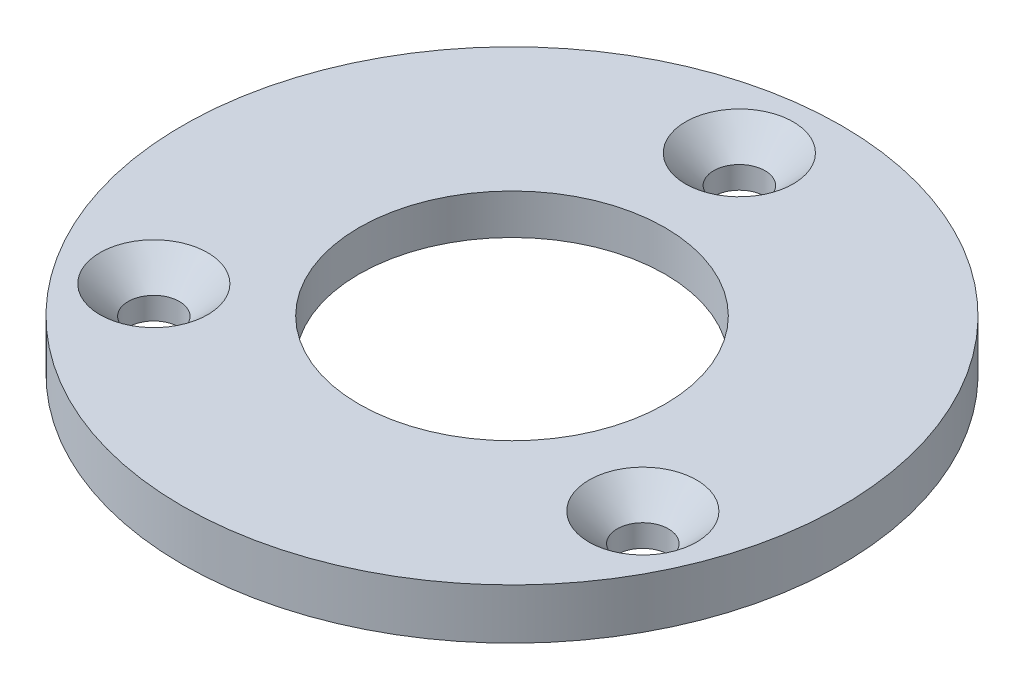
ISO-10303-21;
HEADER;
FILE_DESCRIPTION(('STEP AP214'),'2;1');
FILE_NAME('part.step','',(''),(''),'','','');
FILE_SCHEMA(('AUTOMOTIVE_DESIGN { 1 0 10303 214 1 1 1 1 }'));
ENDSEC;
DATA;
#1=APPLICATION_CONTEXT('core data for automotive mechanical design processes');
#2=APPLICATION_PROTOCOL_DEFINITION('international standard','automotive_design',2000,#1);
#3=PRODUCT_CONTEXT('',#1,'mechanical');
#4=PRODUCT('Part','Part','',(#3));
#5=PRODUCT_RELATED_PRODUCT_CATEGORY('part','',(#4));
#6=PRODUCT_DEFINITION_FORMATION('','',#4);
#7=PRODUCT_DEFINITION_CONTEXT('part definition',#1,'design');
#8=PRODUCT_DEFINITION('design','',#6,#7);
#9=PRODUCT_DEFINITION_SHAPE('','',#8);
#10=(LENGTH_UNIT() NAMED_UNIT(*) SI_UNIT(.MILLI.,.METRE.));
#11=(NAMED_UNIT(*) PLANE_ANGLE_UNIT() SI_UNIT($,.RADIAN.));
#12=(NAMED_UNIT(*) SI_UNIT($,.STERADIAN.) SOLID_ANGLE_UNIT());
#13=UNCERTAINTY_MEASURE_WITH_UNIT(LENGTH_MEASURE(1.E-05),#10,'distance_accuracy_value','');
#14=(GEOMETRIC_REPRESENTATION_CONTEXT(3) GLOBAL_UNCERTAINTY_ASSIGNED_CONTEXT((#13)) GLOBAL_UNIT_ASSIGNED_CONTEXT((#10,
#11,#12)) REPRESENTATION_CONTEXT('',''));
#15=CARTESIAN_POINT('',(0.,0.,0.));
#16=DIRECTION('',(0.,0.,1.));
#17=DIRECTION('',(1.,0.,0.));
#18=AXIS2_PLACEMENT_3D('',#15,#16,#17);
#19=CARTESIAN_POINT('',(0.,0.,0.));
#20=DIRECTION('',(0.,-1.,0.));
#21=DIRECTION('',(0.,0.,-1.));
#22=AXIS2_PLACEMENT_3D('',#19,#20,#21);
#23=CYLINDRICAL_SURFACE('',#22,9.5504);
#24=CARTESIAN_POINT('',(0.,0.,0.));
#25=DIRECTION('',(0.,-1.,0.));
#26=DIRECTION('',(0.,0.,-1.));
#27=AXIS2_PLACEMENT_3D('',#24,#25,#26);
#28=CIRCLE('',#27,9.5504);
#29=CARTESIAN_POINT('',(0.,0.,-9.5504));
#30=VERTEX_POINT('',#29);
#31=EDGE_CURVE('E10',#30,#30,#28,.T.);
#32=ORIENTED_EDGE('',*,*,#31,.F.);
#33=EDGE_LOOP('',(#32));
#34=FACE_BOUND('',#33,.T.);
#35=CARTESIAN_POINT('',(0.,-2.5146,0.));
#36=DIRECTION('',(0.,-1.,0.));
#37=DIRECTION('',(0.,0.,-1.));
#38=AXIS2_PLACEMENT_3D('',#35,#36,#37);
#39=CIRCLE('',#38,9.5504);
#40=CARTESIAN_POINT('',(0.,-2.5146,-9.5504));
#41=VERTEX_POINT('',#40);
#42=EDGE_CURVE('E52',#41,#41,#39,.T.);
#43=ORIENTED_EDGE('',*,*,#42,.T.);
#44=EDGE_LOOP('',(#43));
#45=FACE_BOUND('',#44,.T.);
#46=ADVANCED_FACE('F30',(#34,#45),#23,.F.);
#47=CARTESIAN_POINT('',(-9.5504,0.,0.));
#48=DIRECTION('',(0.,-1.,0.));
#49=DIRECTION('',(0.,0.,-1.));
#50=AXIS2_PLACEMENT_3D('',#47,#48,#49);
#51=PLANE('',#50);
#52=CARTESIAN_POINT('',(-1.71561262375997,0.,-15.9097667275543));
#53=DIRECTION('',(0.,1.,0.));
#54=DIRECTION('',(0.,0.,1.));
#55=AXIS2_PLACEMENT_3D('',#52,#53,#54);
#56=CIRCLE('',#55,3.36);
#57=CARTESIAN_POINT('',(-1.71561262375997,0.,-12.5497667275543));
#58=VERTEX_POINT('',#57);
#59=EDGE_CURVE('E79',#58,#58,#56,.T.);
#60=ORIENTED_EDGE('',*,*,#59,.F.);
#61=EDGE_LOOP('',(#60));
#62=FACE_BOUND('',#61,.T.);
#63=CARTESIAN_POINT('',(14.6360684662274,0.,6.46911924854708));
#64=DIRECTION('',(0.,1.,0.));
#65=DIRECTION('',(0.,0.,1.));
#66=AXIS2_PLACEMENT_3D('',#63,#64,#65);
#67=CIRCLE('',#66,3.36);
#68=CARTESIAN_POINT('',(14.6360684662274,0.,9.82911924854708));
#69=VERTEX_POINT('',#68);
#70=EDGE_CURVE('E70',#69,#69,#67,.T.);
#71=ORIENTED_EDGE('',*,*,#70,.F.);
#72=EDGE_LOOP('',(#71));
#73=FACE_BOUND('',#72,.T.);
#74=CARTESIAN_POINT('',(-12.9204558424654,0.,9.44064747900706));
#75=DIRECTION('',(0.,1.,0.));
#76=DIRECTION('',(0.,0.,1.));
#77=AXIS2_PLACEMENT_3D('',#74,#75,#76);
#78=CIRCLE('',#77,3.36);
#79=CARTESIAN_POINT('',(-12.9204558424654,0.,12.8006474790071));
#80=VERTEX_POINT('',#79);
#81=EDGE_CURVE('E61',#80,#80,#78,.T.);
#82=ORIENTED_EDGE('',*,*,#81,.F.);
#83=EDGE_LOOP('',(#82));
#84=FACE_BOUND('',#83,.T.);
#85=CARTESIAN_POINT('',(0.,0.,0.));
#86=DIRECTION('',(0.,-1.,0.));
#87=DIRECTION('',(0.,0.,-1.));
#88=AXIS2_PLACEMENT_3D('',#85,#86,#87);
#89=CIRCLE('',#88,20.574);
#90=CARTESIAN_POINT('',(0.,0.,-20.574));
#91=VERTEX_POINT('',#90);
#92=EDGE_CURVE('E36',#91,#91,#89,.T.);
#93=ORIENTED_EDGE('',*,*,#92,.F.);
#94=EDGE_LOOP('',(#93));
#95=FACE_BOUND('',#94,.T.);
#96=ORIENTED_EDGE('',*,*,#31,.T.);
#97=EDGE_LOOP('',(#96));
#98=FACE_BOUND('',#97,.T.);
#99=ADVANCED_FACE('F85',(#62,#73,#84,#95,#98),#51,.F.);
#100=CARTESIAN_POINT('',(0.,0.,0.));
#101=DIRECTION('',(0.,-1.,0.));
#102=DIRECTION('',(0.,0.,-1.));
#103=AXIS2_PLACEMENT_3D('',#100,#101,#102);
#104=CYLINDRICAL_SURFACE('',#103,20.574);
#105=CARTESIAN_POINT('',(0.,-3.1496,0.));
#106=DIRECTION('',(0.,-1.,0.));
#107=DIRECTION('',(0.,0.,-1.));
#108=AXIS2_PLACEMENT_3D('',#105,#106,#107);
#109=CIRCLE('',#108,20.574);
#110=CARTESIAN_POINT('',(0.,-3.1496,-20.574));
#111=VERTEX_POINT('',#110);
#112=EDGE_CURVE('E40',#111,#111,#109,.T.);
#113=ORIENTED_EDGE('',*,*,#112,.F.);
#114=EDGE_LOOP('',(#113));
#115=FACE_BOUND('',#114,.T.);
#116=ORIENTED_EDGE('',*,*,#92,.T.);
#117=EDGE_LOOP('',(#116));
#118=FACE_BOUND('',#117,.T.);
#119=ADVANCED_FACE('F88',(#115,#118),#104,.T.);
#120=CARTESIAN_POINT('',(-20.574,-3.1496,0.));
#121=DIRECTION('',(0.,1.,0.));
#122=DIRECTION('',(0.,0.,1.));
#123=AXIS2_PLACEMENT_3D('',#120,#121,#122);
#124=PLANE('',#123);
#125=CARTESIAN_POINT('',(-1.71561262375997,-3.1496,-15.9097667275543));
#126=DIRECTION('',(0.,1.,0.));
#127=DIRECTION('',(0.,0.,1.));
#128=AXIS2_PLACEMENT_3D('',#125,#126,#127);
#129=CIRCLE('',#128,1.6);
#130=CARTESIAN_POINT('',(-1.71561262375997,-3.1496,-14.3097667275544));
#131=VERTEX_POINT('',#130);
#132=EDGE_CURVE('E73',#131,#131,#129,.T.);
#133=ORIENTED_EDGE('',*,*,#132,.T.);
#134=EDGE_LOOP('',(#133));
#135=FACE_BOUND('',#134,.T.);
#136=CARTESIAN_POINT('',(14.6360684662274,-3.1496,6.46911924854708));
#137=DIRECTION('',(0.,1.,0.));
#138=DIRECTION('',(0.,0.,1.));
#139=AXIS2_PLACEMENT_3D('',#136,#137,#138);
#140=CIRCLE('',#139,1.6);
#141=CARTESIAN_POINT('',(14.6360684662274,-3.1496,8.06911924854708));
#142=VERTEX_POINT('',#141);
#143=EDGE_CURVE('E64',#142,#142,#140,.T.);
#144=ORIENTED_EDGE('',*,*,#143,.T.);
#145=EDGE_LOOP('',(#144));
#146=FACE_BOUND('',#145,.T.);
#147=CARTESIAN_POINT('',(-12.9204558424654,-3.1496,9.44064747900706));
#148=DIRECTION('',(0.,1.,0.));
#149=DIRECTION('',(0.,0.,1.));
#150=AXIS2_PLACEMENT_3D('',#147,#148,#149);
#151=CIRCLE('',#150,1.6);
#152=CARTESIAN_POINT('',(-12.9204558424654,-3.1496,11.0406474790071));
#153=VERTEX_POINT('',#152);
#154=EDGE_CURVE('E55',#153,#153,#151,.T.);
#155=ORIENTED_EDGE('',*,*,#154,.T.);
#156=EDGE_LOOP('',(#155));
#157=FACE_BOUND('',#156,.T.);
#158=CARTESIAN_POINT('',(0.,-3.1496,0.));
#159=DIRECTION('',(0.,-1.,0.));
#160=DIRECTION('',(0.,0.,-1.));
#161=AXIS2_PLACEMENT_3D('',#158,#159,#160);
#162=CIRCLE('',#161,13.208);
#163=CARTESIAN_POINT('',(0.,-3.1496,-13.208));
#164=VERTEX_POINT('',#163);
#165=EDGE_CURVE('E44',#164,#164,#162,.T.);
#166=ORIENTED_EDGE('',*,*,#165,.F.);
#167=EDGE_LOOP('',(#166));
#168=FACE_BOUND('',#167,.T.);
#169=ORIENTED_EDGE('',*,*,#112,.T.);
#170=EDGE_LOOP('',(#169));
#171=FACE_BOUND('',#170,.T.);
#172=ADVANCED_FACE('F126',(#135,#146,#157,#168,#171),#124,.F.);
#173=CARTESIAN_POINT('',(0.,0.,0.));
#174=DIRECTION('',(0.,-1.,0.));
#175=DIRECTION('',(0.,0.,-1.));
#176=AXIS2_PLACEMENT_3D('',#173,#174,#175);
#177=CYLINDRICAL_SURFACE('',#176,13.208);
#178=CARTESIAN_POINT('',(0.,-2.5146,0.));
#179=DIRECTION('',(0.,-1.,0.));
#180=DIRECTION('',(0.,0.,-1.));
#181=AXIS2_PLACEMENT_3D('',#178,#179,#180);
#182=CIRCLE('',#181,13.208);
#183=CARTESIAN_POINT('',(0.,-2.5146,-13.208));
#184=VERTEX_POINT('',#183);
#185=EDGE_CURVE('E49',#184,#184,#182,.T.);
#186=ORIENTED_EDGE('',*,*,#185,.F.);
#187=EDGE_LOOP('',(#186));
#188=FACE_BOUND('',#187,.T.);
#189=ORIENTED_EDGE('',*,*,#165,.T.);
#190=EDGE_LOOP('',(#189));
#191=FACE_BOUND('',#190,.T.);
#192=ADVANCED_FACE('F120',(#188,#191),#177,.F.);
#193=CARTESIAN_POINT('',(-13.208,-2.5146,0.));
#194=DIRECTION('',(0.,1.,0.));
#195=DIRECTION('',(0.,0.,1.));
#196=AXIS2_PLACEMENT_3D('',#193,#194,#195);
#197=PLANE('',#196);
#198=ORIENTED_EDGE('',*,*,#42,.F.);
#199=EDGE_LOOP('',(#198));
#200=FACE_BOUND('',#199,.T.);
#201=ORIENTED_EDGE('',*,*,#185,.T.);
#202=EDGE_LOOP('',(#201));
#203=FACE_BOUND('',#202,.T.);
#204=ADVANCED_FACE('F107',(#200,#203),#197,.F.);
#205=CARTESIAN_POINT('',(-12.9204558424654,0.,9.44064747900706));
#206=DIRECTION('',(0.,1.,0.));
#207=DIRECTION('',(0.,0.,1.));
#208=AXIS2_PLACEMENT_3D('',#205,#206,#207);
#209=CYLINDRICAL_SURFACE('',#208,1.6);
#210=ORIENTED_EDGE('',*,*,#154,.F.);
#211=EDGE_LOOP('',(#210));
#212=FACE_BOUND('',#211,.T.);
#213=CARTESIAN_POINT('',(-12.9204558424654,-1.76,9.44064747900706));
#214=DIRECTION('',(0.,1.,0.));
#215=DIRECTION('',(0.,0.,1.));
#216=AXIS2_PLACEMENT_3D('',#213,#214,#215);
#217=CIRCLE('',#216,1.6);
#218=CARTESIAN_POINT('',(-12.9204558424654,-1.76,11.0406474790071));
#219=VERTEX_POINT('',#218);
#220=EDGE_CURVE('E58',#219,#219,#217,.T.);
#221=ORIENTED_EDGE('',*,*,#220,.T.);
#222=EDGE_LOOP('',(#221));
#223=FACE_BOUND('',#222,.T.);
#224=ADVANCED_FACE('F97',(#212,#223),#209,.F.);
#225=CARTESIAN_POINT('',(-12.9204558424654,0.,9.44064747900706));
#226=DIRECTION('',(0.,1.,0.));
#227=DIRECTION('',(0.,0.,1.));
#228=AXIS2_PLACEMENT_3D('',#225,#226,#227);
#229=CONICAL_SURFACE('',#228,3.36,0.785398163397449);
#230=ORIENTED_EDGE('',*,*,#220,.F.);
#231=EDGE_LOOP('',(#230));
#232=FACE_BOUND('',#231,.T.);
#233=ORIENTED_EDGE('',*,*,#81,.T.);
#234=EDGE_LOOP('',(#233));
#235=FACE_BOUND('',#234,.T.);
#236=ADVANCED_FACE('F94',(#232,#235),#229,.F.);
#237=CARTESIAN_POINT('',(14.6360684662274,0.,6.46911924854708));
#238=DIRECTION('',(0.,1.,0.));
#239=DIRECTION('',(0.,0.,1.));
#240=AXIS2_PLACEMENT_3D('',#237,#238,#239);
#241=CYLINDRICAL_SURFACE('',#240,1.6);
#242=ORIENTED_EDGE('',*,*,#143,.F.);
#243=EDGE_LOOP('',(#242));
#244=FACE_BOUND('',#243,.T.);
#245=CARTESIAN_POINT('',(14.6360684662274,-1.76,6.46911924854708));
#246=DIRECTION('',(0.,1.,0.));
#247=DIRECTION('',(0.,0.,1.));
#248=AXIS2_PLACEMENT_3D('',#245,#246,#247);
#249=CIRCLE('',#248,1.6);
#250=CARTESIAN_POINT('',(14.6360684662274,-1.76,8.06911924854708));
#251=VERTEX_POINT('',#250);
#252=EDGE_CURVE('E67',#251,#251,#249,.T.);
#253=ORIENTED_EDGE('',*,*,#252,.T.);
#254=EDGE_LOOP('',(#253));
#255=FACE_BOUND('',#254,.T.);
#256=ADVANCED_FACE('F96',(#244,#255),#241,.F.);
#257=CARTESIAN_POINT('',(14.6360684662274,0.,6.46911924854708));
#258=DIRECTION('',(0.,1.,0.));
#259=DIRECTION('',(0.,0.,1.));
#260=AXIS2_PLACEMENT_3D('',#257,#258,#259);
#261=CONICAL_SURFACE('',#260,3.36,0.785398163397449);
#262=ORIENTED_EDGE('',*,*,#252,.F.);
#263=EDGE_LOOP('',(#262));
#264=FACE_BOUND('',#263,.T.);
#265=ORIENTED_EDGE('',*,*,#70,.T.);
#266=EDGE_LOOP('',(#265));
#267=FACE_BOUND('',#266,.T.);
#268=ADVANCED_FACE('F104',(#264,#267),#261,.F.);
#269=CARTESIAN_POINT('',(-1.71561262375997,0.,-15.9097667275543));
#270=DIRECTION('',(0.,1.,0.));
#271=DIRECTION('',(0.,0.,1.));
#272=AXIS2_PLACEMENT_3D('',#269,#270,#271);
#273=CYLINDRICAL_SURFACE('',#272,1.6);
#274=ORIENTED_EDGE('',*,*,#132,.F.);
#275=EDGE_LOOP('',(#274));
#276=FACE_BOUND('',#275,.T.);
#277=CARTESIAN_POINT('',(-1.71561262375997,-1.76,-15.9097667275543));
#278=DIRECTION('',(0.,1.,0.));
#279=DIRECTION('',(0.,0.,1.));
#280=AXIS2_PLACEMENT_3D('',#277,#278,#279);
#281=CIRCLE('',#280,1.6);
#282=CARTESIAN_POINT('',(-1.71561262375997,-1.76,-14.3097667275544));
#283=VERTEX_POINT('',#282);
#284=EDGE_CURVE('E76',#283,#283,#281,.T.);
#285=ORIENTED_EDGE('',*,*,#284,.T.);
#286=EDGE_LOOP('',(#285));
#287=FACE_BOUND('',#286,.T.);
#288=ADVANCED_FACE('F177',(#276,#287),#273,.F.);
#289=CARTESIAN_POINT('',(-1.71561262375997,0.,-15.9097667275543));
#290=DIRECTION('',(0.,1.,0.));
#291=DIRECTION('',(0.,0.,1.));
#292=AXIS2_PLACEMENT_3D('',#289,#290,#291);
#293=CONICAL_SURFACE('',#292,3.36,0.785398163397449);
#294=ORIENTED_EDGE('',*,*,#284,.F.);
#295=EDGE_LOOP('',(#294));
#296=FACE_BOUND('',#295,.T.);
#297=ORIENTED_EDGE('',*,*,#59,.T.);
#298=EDGE_LOOP('',(#297));
#299=FACE_BOUND('',#298,.T.);
#300=ADVANCED_FACE('F83',(#296,#299),#293,.F.);
#301=CLOSED_SHELL('',(#46,#99,#119,#172,#192,#204,#224,#236,#256,#268,#288,#300));
#302=MANIFOLD_SOLID_BREP('B2',#301);
#303=ADVANCED_BREP_SHAPE_REPRESENTATION('',(#18,#302),#14);
#304=SHAPE_DEFINITION_REPRESENTATION(#9,#303);
ENDSEC;
END-ISO-10303-21;
